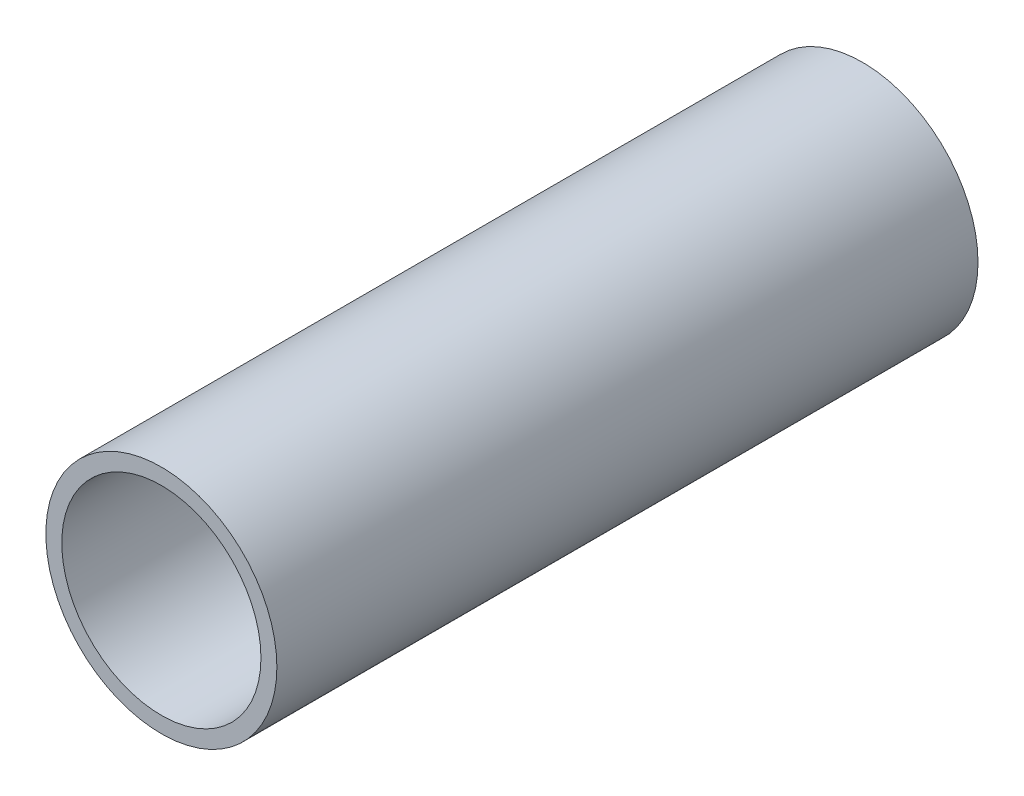
ISO-10303-21;
HEADER;
FILE_DESCRIPTION(('STEP AP214'),'2;1');
FILE_NAME('part.step','',(''),(''),'','','');
FILE_SCHEMA(('AUTOMOTIVE_DESIGN { 1 0 10303 214 1 1 1 1 }'));
ENDSEC;
DATA;
#1=APPLICATION_CONTEXT('core data for automotive mechanical design processes');
#2=APPLICATION_PROTOCOL_DEFINITION('international standard','automotive_design',2000,#1);
#3=PRODUCT_CONTEXT('',#1,'mechanical');
#4=PRODUCT('Part','Part','',(#3));
#5=PRODUCT_RELATED_PRODUCT_CATEGORY('part','',(#4));
#6=PRODUCT_DEFINITION_FORMATION('','',#4);
#7=PRODUCT_DEFINITION_CONTEXT('part definition',#1,'design');
#8=PRODUCT_DEFINITION('design','',#6,#7);
#9=PRODUCT_DEFINITION_SHAPE('','',#8);
#10=(LENGTH_UNIT() NAMED_UNIT(*) SI_UNIT(.MILLI.,.METRE.));
#11=(NAMED_UNIT(*) PLANE_ANGLE_UNIT() SI_UNIT($,.RADIAN.));
#12=(NAMED_UNIT(*) SI_UNIT($,.STERADIAN.) SOLID_ANGLE_UNIT());
#13=UNCERTAINTY_MEASURE_WITH_UNIT(LENGTH_MEASURE(1.E-05),#10,'distance_accuracy_value','');
#14=(GEOMETRIC_REPRESENTATION_CONTEXT(3) GLOBAL_UNCERTAINTY_ASSIGNED_CONTEXT((#13)) GLOBAL_UNIT_ASSIGNED_CONTEXT((#10,
#11,#12)) REPRESENTATION_CONTEXT('',''));
#15=CARTESIAN_POINT('',(0.,0.,0.));
#16=DIRECTION('',(0.,0.,1.));
#17=DIRECTION('',(1.,0.,0.));
#18=AXIS2_PLACEMENT_3D('',#15,#16,#17);
#19=CARTESIAN_POINT('',(0.,0.,88.));
#20=DIRECTION('',(0.,0.,1.));
#21=DIRECTION('',(1.,0.,0.));
#22=AXIS2_PLACEMENT_3D('',#19,#20,#21);
#23=PLANE('',#22);
#24=CARTESIAN_POINT('',(0.,0.,88.));
#25=DIRECTION('',(0.,0.,1.));
#26=DIRECTION('',(1.,0.,0.));
#27=AXIS2_PLACEMENT_3D('',#24,#25,#26);
#28=CIRCLE('',#27,14.5);
#29=CARTESIAN_POINT('',(14.5,0.,88.));
#30=VERTEX_POINT('',#29);
#31=EDGE_CURVE('E10',#30,#30,#28,.T.);
#32=ORIENTED_EDGE('',*,*,#31,.T.);
#33=EDGE_LOOP('',(#32));
#34=FACE_BOUND('',#33,.T.);
#35=CARTESIAN_POINT('',(0.,0.,88.));
#36=DIRECTION('',(0.,0.,1.));
#37=DIRECTION('',(1.,0.,0.));
#38=AXIS2_PLACEMENT_3D('',#35,#36,#37);
#39=CIRCLE('',#38,12.5);
#40=CARTESIAN_POINT('',(12.5,0.,88.));
#41=VERTEX_POINT('',#40);
#42=EDGE_CURVE('E52',#41,#41,#39,.T.);
#43=ORIENTED_EDGE('',*,*,#42,.F.);
#44=EDGE_LOOP('',(#43));
#45=FACE_BOUND('',#44,.T.);
#46=ADVANCED_FACE('F39',(#34,#45),#23,.T.);
#47=CARTESIAN_POINT('',(0.,0.,0.));
#48=DIRECTION('',(0.,0.,1.));
#49=DIRECTION('',(1.,0.,0.));
#50=AXIS2_PLACEMENT_3D('',#47,#48,#49);
#51=PLANE('',#50);
#52=CARTESIAN_POINT('',(0.,0.,0.));
#53=DIRECTION('',(0.,0.,1.));
#54=DIRECTION('',(1.,0.,0.));
#55=AXIS2_PLACEMENT_3D('',#52,#53,#54);
#56=CIRCLE('',#55,14.5);
#57=CARTESIAN_POINT('',(14.5,0.,0.));
#58=VERTEX_POINT('',#57);
#59=EDGE_CURVE('E43',#58,#58,#56,.T.);
#60=ORIENTED_EDGE('',*,*,#59,.F.);
#61=EDGE_LOOP('',(#60));
#62=FACE_BOUND('',#61,.T.);
#63=CARTESIAN_POINT('',(0.,0.,0.));
#64=DIRECTION('',(0.,0.,1.));
#65=DIRECTION('',(1.,0.,0.));
#66=AXIS2_PLACEMENT_3D('',#63,#64,#65);
#67=CIRCLE('',#66,12.5);
#68=CARTESIAN_POINT('',(12.5,0.,0.));
#69=VERTEX_POINT('',#68);
#70=EDGE_CURVE('E54',#69,#69,#67,.T.);
#71=ORIENTED_EDGE('',*,*,#70,.T.);
#72=EDGE_LOOP('',(#71));
#73=FACE_BOUND('',#72,.T.);
#74=ADVANCED_FACE('F66',(#62,#73),#51,.F.);
#75=CARTESIAN_POINT('',(0.,0.,88.));
#76=DIRECTION('',(0.,0.,-1.));
#77=DIRECTION('',(-1.,0.,0.));
#78=AXIS2_PLACEMENT_3D('',#75,#76,#77);
#79=CYLINDRICAL_SURFACE('',#78,14.5);
#80=ORIENTED_EDGE('',*,*,#31,.F.);
#81=EDGE_LOOP('',(#80));
#82=FACE_BOUND('',#81,.T.);
#83=ORIENTED_EDGE('',*,*,#59,.T.);
#84=EDGE_LOOP('',(#83));
#85=FACE_BOUND('',#84,.T.);
#86=ADVANCED_FACE('F41',(#82,#85),#79,.T.);
#87=CARTESIAN_POINT('',(0.,0.,88.));
#88=DIRECTION('',(0.,0.,-1.));
#89=DIRECTION('',(-1.,0.,0.));
#90=AXIS2_PLACEMENT_3D('',#87,#88,#89);
#91=CYLINDRICAL_SURFACE('',#90,12.5);
#92=ORIENTED_EDGE('',*,*,#42,.T.);
#93=EDGE_LOOP('',(#92));
#94=FACE_BOUND('',#93,.T.);
#95=ORIENTED_EDGE('',*,*,#70,.F.);
#96=EDGE_LOOP('',(#95));
#97=FACE_BOUND('',#96,.T.);
#98=ADVANCED_FACE('F62',(#94,#97),#91,.F.);
#99=CLOSED_SHELL('',(#46,#74,#86,#98));
#100=MANIFOLD_SOLID_BREP('B2',#99);
#101=ADVANCED_BREP_SHAPE_REPRESENTATION('',(#18,#100),#14);
#102=SHAPE_DEFINITION_REPRESENTATION(#9,#101);
ENDSEC;
END-ISO-10303-21;
